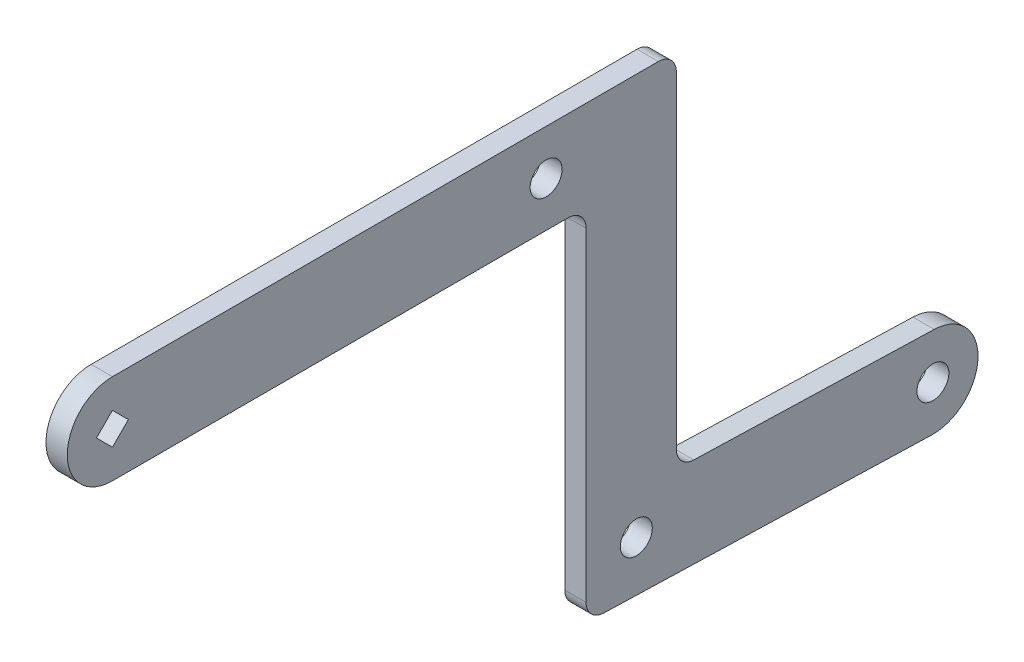
ISO-10303-21;
HEADER;
FILE_DESCRIPTION(('STEP AP214'),'2;1');
FILE_NAME('part.step','',(''),(''),'','','');
FILE_SCHEMA(('AUTOMOTIVE_DESIGN { 1 0 10303 214 1 1 1 1 }'));
ENDSEC;
DATA;
#1=APPLICATION_CONTEXT('core data for automotive mechanical design processes');
#2=APPLICATION_PROTOCOL_DEFINITION('international standard','automotive_design',2000,#1);
#3=PRODUCT_CONTEXT('',#1,'mechanical');
#4=PRODUCT('Part','Part','',(#3));
#5=PRODUCT_RELATED_PRODUCT_CATEGORY('part','',(#4));
#6=PRODUCT_DEFINITION_FORMATION('','',#4);
#7=PRODUCT_DEFINITION_CONTEXT('part definition',#1,'design');
#8=PRODUCT_DEFINITION('design','',#6,#7);
#9=PRODUCT_DEFINITION_SHAPE('','',#8);
#10=(LENGTH_UNIT() NAMED_UNIT(*) SI_UNIT(.MILLI.,.METRE.));
#11=(NAMED_UNIT(*) PLANE_ANGLE_UNIT() SI_UNIT($,.RADIAN.));
#12=(NAMED_UNIT(*) SI_UNIT($,.STERADIAN.) SOLID_ANGLE_UNIT());
#13=UNCERTAINTY_MEASURE_WITH_UNIT(LENGTH_MEASURE(1.E-05),#10,'distance_accuracy_value','');
#14=(GEOMETRIC_REPRESENTATION_CONTEXT(3) GLOBAL_UNCERTAINTY_ASSIGNED_CONTEXT((#13)) GLOBAL_UNIT_ASSIGNED_CONTEXT((#10,
#11,#12)) REPRESENTATION_CONTEXT('',''));
#15=CARTESIAN_POINT('',(0.,0.,0.));
#16=DIRECTION('',(0.,0.,1.));
#17=DIRECTION('',(1.,0.,0.));
#18=AXIS2_PLACEMENT_3D('',#15,#16,#17);
#19=CARTESIAN_POINT('',(3.,0.,0.));
#20=DIRECTION('',(1.,0.,0.));
#21=DIRECTION('',(0.,0.,-1.));
#22=AXIS2_PLACEMENT_3D('',#19,#20,#21);
#23=PLANE('',#22);
#24=CARTESIAN_POINT('',(3.,0.,-61.0422991513148));
#25=DIRECTION('',(1.,0.,0.));
#26=DIRECTION('',(0.,0.,-1.));
#27=AXIS2_PLACEMENT_3D('',#24,#25,#26);
#28=CIRCLE('',#27,2.2479);
#29=CARTESIAN_POINT('',(3.,0.,-63.2901991513148));
#30=VERTEX_POINT('',#29);
#31=EDGE_CURVE('E507',#30,#30,#28,.T.);
#32=ORIENTED_EDGE('',*,*,#31,.F.);
#33=EDGE_LOOP('',(#32));
#34=FACE_BOUND('',#33,.T.);
#35=CARTESIAN_POINT('',(3.,-50.1038340194328,-73.7422991513148));
#36=DIRECTION('',(1.,0.,0.));
#37=DIRECTION('',(0.,0.,-1.));
#38=AXIS2_PLACEMENT_3D('',#35,#36,#37);
#39=CIRCLE('',#38,2.24789999999996);
#40=CARTESIAN_POINT('',(3.,-50.1038340194328,-75.9901991513148));
#41=VERTEX_POINT('',#40);
#42=EDGE_CURVE('E509',#41,#41,#39,.T.);
#43=ORIENTED_EDGE('',*,*,#42,.F.);
#44=EDGE_LOOP('',(#43));
#45=FACE_BOUND('',#44,.T.);
#46=DIRECTION('',(0.,0.707106781186548,0.707106781186547));
#47=VECTOR('',#46,1.);
#48=CARTESIAN_POINT('',(3.,2.24506403026718,0.));
#49=LINE('',#48,#47);
#50=CARTESIAN_POINT('',(3.,0.,-2.24506403026718));
#51=VERTEX_POINT('',#50);
#52=CARTESIAN_POINT('',(3.,2.24506403026718,0.));
#53=VERTEX_POINT('',#52);
#54=EDGE_CURVE('E157',#51,#53,#49,.T.);
#55=ORIENTED_EDGE('',*,*,#54,.F.);
#56=DIRECTION('',(0.,0.707106781186548,-0.707106781186548));
#57=VECTOR('',#56,1.);
#58=CARTESIAN_POINT('',(3.,0.,-2.24506403026718));
#59=LINE('',#58,#57);
#60=CARTESIAN_POINT('',(3.,-2.24506403026719,0.));
#61=VERTEX_POINT('',#60);
#62=EDGE_CURVE('E147',#61,#51,#59,.T.);
#63=ORIENTED_EDGE('',*,*,#62,.F.);
#64=DIRECTION('',(0.,-0.707106781186548,-0.707106781186548));
#65=VECTOR('',#64,1.);
#66=CARTESIAN_POINT('',(3.,0.,2.24506403026718));
#67=LINE('',#66,#65);
#68=CARTESIAN_POINT('',(3.,0.,2.24506403026718));
#69=VERTEX_POINT('',#68);
#70=EDGE_CURVE('E172',#69,#61,#67,.T.);
#71=ORIENTED_EDGE('',*,*,#70,.F.);
#72=DIRECTION('',(0.,-0.707106781186547,0.707106781186548));
#73=VECTOR('',#72,1.);
#74=CARTESIAN_POINT('',(3.,2.24506403026718,0.));
#75=LINE('',#74,#73);
#76=EDGE_CURVE('E170',#53,#69,#75,.T.);
#77=ORIENTED_EDGE('',*,*,#76,.F.);
#78=EDGE_LOOP('',(#55,#63,#71,#77));
#79=FACE_BOUND('',#78,.T.);
#80=DIRECTION('',(0.,1.,0.));
#81=VECTOR('',#80,1.);
#82=CARTESIAN_POINT('',(3.,6.35,-79.375));
#83=LINE('',#82,#81);
#84=CARTESIAN_POINT('',(3.,-42.1719184584307,-79.375));
#85=VERTEX_POINT('',#84);
#86=CARTESIAN_POINT('',(3.,3.81,-79.375));
#87=VERTEX_POINT('',#86);
#88=EDGE_CURVE('E206',#85,#87,#83,.T.);
#89=ORIENTED_EDGE('',*,*,#88,.T.);
#90=CARTESIAN_POINT('',(3.,3.81,-76.835));
#91=DIRECTION('',(1.,0.,0.));
#92=DIRECTION('',(0.,0.,-1.));
#93=AXIS2_PLACEMENT_3D('',#90,#91,#92);
#94=CIRCLE('',#93,2.54);
#95=CARTESIAN_POINT('',(3.,6.35,-76.835));
#96=VERTEX_POINT('',#95);
#97=EDGE_CURVE('E256',#87,#96,#94,.T.);
#98=ORIENTED_EDGE('',*,*,#97,.T.);
#99=DIRECTION('',(0.,0.,1.));
#100=VECTOR('',#99,1.);
#101=CARTESIAN_POINT('',(3.,6.35,-79.375));
#102=LINE('',#101,#100);
#103=CARTESIAN_POINT('',(3.,6.35,0.));
#104=VERTEX_POINT('',#103);
#105=EDGE_CURVE('E209',#96,#104,#102,.T.);
#106=ORIENTED_EDGE('',*,*,#105,.T.);
#107=CARTESIAN_POINT('',(3.,0.,0.));
#108=DIRECTION('',(1.,0.,0.));
#109=DIRECTION('',(0.,0.,-1.));
#110=AXIS2_PLACEMENT_3D('',#107,#108,#109);
#111=CIRCLE('',#110,6.35);
#112=CARTESIAN_POINT('',(3.,-6.35,0.));
#113=VERTEX_POINT('',#112);
#114=EDGE_CURVE('E190',#104,#113,#111,.T.);
#115=ORIENTED_EDGE('',*,*,#114,.T.);
#116=DIRECTION('',(0.,0.,-1.));
#117=VECTOR('',#116,1.);
#118=CARTESIAN_POINT('',(3.,-6.35,0.));
#119=LINE('',#118,#117);
#120=CARTESIAN_POINT('',(3.,-6.35,-64.135));
#121=VERTEX_POINT('',#120);
#122=EDGE_CURVE('E193',#113,#121,#119,.T.);
#123=ORIENTED_EDGE('',*,*,#122,.T.);
#124=CARTESIAN_POINT('',(3.,-8.89,-64.135));
#125=DIRECTION('',(1.,0.,0.));
#126=DIRECTION('',(0.,0.,-1.));
#127=AXIS2_PLACEMENT_3D('',#124,#125,#126);
#128=CIRCLE('',#127,2.54);
#129=CARTESIAN_POINT('',(3.,-8.89,-66.675));
#130=VERTEX_POINT('',#129);
#131=EDGE_CURVE('E11',#121,#130,#128,.F.);
#132=ORIENTED_EDGE('',*,*,#131,.T.);
#133=DIRECTION('',(0.,-1.,0.));
#134=VECTOR('',#133,1.);
#135=CARTESIAN_POINT('',(3.,-6.35,-66.675));
#136=LINE('',#135,#134);
#137=CARTESIAN_POINT('',(3.,-54.4977492321011,-66.675));
#138=VERTEX_POINT('',#137);
#139=EDGE_CURVE('E197',#130,#138,#136,.T.);
#140=ORIENTED_EDGE('',*,*,#139,.T.);
#141=CARTESIAN_POINT('',(3.,-54.4977492321011,-69.215));
#142=DIRECTION('',(1.,0.,0.));
#143=DIRECTION('',(0.,0.,-1.));
#144=AXIS2_PLACEMENT_3D('',#141,#142,#143);
#145=CIRCLE('',#144,2.54);
#146=CARTESIAN_POINT('',(3.,-57.0366138925563,-69.1390642647262));
#147=VERTEX_POINT('',#146);
#148=EDGE_CURVE('E47',#138,#147,#145,.T.);
#149=ORIENTED_EDGE('',*,*,#148,.T.);
#150=DIRECTION('',(0.,-0.0298959587691965,-0.999553015927255));
#151=VECTOR('',#150,1.);
#152=CARTESIAN_POINT('',(3.,-56.9629153868352,-66.675));
#153=LINE('',#152,#151);
#154=CARTESIAN_POINT('',(3.,-58.4171616511381,-115.296830482406));
#155=VERTEX_POINT('',#154);
#156=EDGE_CURVE('E199',#147,#155,#153,.T.);
#157=ORIENTED_EDGE('',*,*,#156,.T.);
#158=CARTESIAN_POINT('',(3.,-52.07,-115.48666982059));
#159=DIRECTION('',(1.,0.,0.));
#160=DIRECTION('',(0.,0.,1.));
#161=AXIS2_PLACEMENT_3D('',#158,#159,#160);
#162=CIRCLE('',#161,6.35);
#163=CARTESIAN_POINT('',(3.,-45.7228383488619,-115.676509158775));
#164=VERTEX_POINT('',#163);
#165=EDGE_CURVE('E201',#155,#164,#162,.T.);
#166=ORIENTED_EDGE('',*,*,#165,.T.);
#167=DIRECTION('',(0.,0.0298959587691966,0.999553015927255));
#168=VECTOR('',#167,1.);
#169=CARTESIAN_POINT('',(3.,-45.7228383488619,-115.676509158775));
#170=LINE('',#169,#168);
#171=CARTESIAN_POINT('',(3.,-44.710783118886,-81.8390642647262));
#172=VERTEX_POINT('',#171);
#173=EDGE_CURVE('E203',#164,#172,#170,.T.);
#174=ORIENTED_EDGE('',*,*,#173,.T.);
#175=CARTESIAN_POINT('',(3.,-42.1719184584307,-81.915));
#176=DIRECTION('',(1.,0.,0.));
#177=DIRECTION('',(0.,0.,-1.));
#178=AXIS2_PLACEMENT_3D('',#175,#176,#177);
#179=CIRCLE('',#178,2.54);
#180=EDGE_CURVE('E269',#172,#85,#179,.F.);
#181=ORIENTED_EDGE('',*,*,#180,.T.);
#182=EDGE_LOOP('',(#89,#98,#106,#115,#123,#132,#140,#149,#157,#166,#174,#181));
#183=FACE_BOUND('',#182,.T.);
#184=CARTESIAN_POINT('',(3.,-52.07,-115.48666982059));
#185=DIRECTION('',(1.,0.,0.));
#186=DIRECTION('',(0.,0.,-1.));
#187=AXIS2_PLACEMENT_3D('',#184,#185,#186);
#188=CIRCLE('',#187,2.24506403026721);
#189=CARTESIAN_POINT('',(3.,-52.07,-117.731733850857));
#190=VERTEX_POINT('',#189);
#191=EDGE_CURVE('E179',#190,#190,#188,.T.);
#192=ORIENTED_EDGE('',*,*,#191,.F.);
#193=EDGE_LOOP('',(#192));
#194=FACE_BOUND('',#193,.T.);
#195=ADVANCED_FACE('F32',(#34,#45,#79,#183,#194),#23,.T.);
#196=CARTESIAN_POINT('',(0.,0.,0.));
#197=DIRECTION('',(1.,0.,0.));
#198=DIRECTION('',(0.,0.,-1.));
#199=AXIS2_PLACEMENT_3D('',#196,#197,#198);
#200=PLANE('',#199);
#201=CARTESIAN_POINT('',(0.,0.,-61.0422991513148));
#202=DIRECTION('',(1.,0.,0.));
#203=DIRECTION('',(0.,0.,-1.));
#204=AXIS2_PLACEMENT_3D('',#201,#202,#203);
#205=CIRCLE('',#204,2.2479);
#206=CARTESIAN_POINT('',(0.,0.,-63.2901991513148));
#207=VERTEX_POINT('',#206);
#208=EDGE_CURVE('E505',#207,#207,#205,.T.);
#209=ORIENTED_EDGE('',*,*,#208,.T.);
#210=EDGE_LOOP('',(#209));
#211=FACE_BOUND('',#210,.T.);
#212=CARTESIAN_POINT('',(0.,-50.1038340194328,-73.7422991513148));
#213=DIRECTION('',(1.,0.,0.));
#214=DIRECTION('',(0.,0.,-1.));
#215=AXIS2_PLACEMENT_3D('',#212,#213,#214);
#216=CIRCLE('',#215,2.24789999999996);
#217=CARTESIAN_POINT('',(0.,-50.1038340194328,-75.9901991513148));
#218=VERTEX_POINT('',#217);
#219=EDGE_CURVE('E512',#218,#218,#216,.T.);
#220=ORIENTED_EDGE('',*,*,#219,.T.);
#221=EDGE_LOOP('',(#220));
#222=FACE_BOUND('',#221,.T.);
#223=DIRECTION('',(0.,0.707106781186548,-0.707106781186548));
#224=VECTOR('',#223,1.);
#225=CARTESIAN_POINT('',(0.,0.,-2.24506403026718));
#226=LINE('',#225,#224);
#227=CARTESIAN_POINT('',(0.,-2.24506403026719,0.));
#228=VERTEX_POINT('',#227);
#229=CARTESIAN_POINT('',(0.,0.,-2.24506403026718));
#230=VERTEX_POINT('',#229);
#231=EDGE_CURVE('E177',#228,#230,#226,.T.);
#232=ORIENTED_EDGE('',*,*,#231,.T.);
#233=DIRECTION('',(0.,0.707106781186548,0.707106781186547));
#234=VECTOR('',#233,1.);
#235=CARTESIAN_POINT('',(0.,2.24506403026718,0.));
#236=LINE('',#235,#234);
#237=CARTESIAN_POINT('',(0.,2.24506403026718,0.));
#238=VERTEX_POINT('',#237);
#239=EDGE_CURVE('E164',#230,#238,#236,.T.);
#240=ORIENTED_EDGE('',*,*,#239,.T.);
#241=DIRECTION('',(0.,-0.707106781186547,0.707106781186548));
#242=VECTOR('',#241,1.);
#243=CARTESIAN_POINT('',(0.,2.24506403026718,0.));
#244=LINE('',#243,#242);
#245=CARTESIAN_POINT('',(0.,0.,2.24506403026718));
#246=VERTEX_POINT('',#245);
#247=EDGE_CURVE('E181',#238,#246,#244,.T.);
#248=ORIENTED_EDGE('',*,*,#247,.T.);
#249=DIRECTION('',(0.,-0.707106781186548,-0.707106781186548));
#250=VECTOR('',#249,1.);
#251=CARTESIAN_POINT('',(0.,0.,2.24506403026718));
#252=LINE('',#251,#250);
#253=EDGE_CURVE('E158',#246,#228,#252,.T.);
#254=ORIENTED_EDGE('',*,*,#253,.T.);
#255=EDGE_LOOP('',(#232,#240,#248,#254));
#256=FACE_BOUND('',#255,.T.);
#257=DIRECTION('',(0.,0.,1.));
#258=VECTOR('',#257,1.);
#259=CARTESIAN_POINT('',(0.,6.35,-79.375));
#260=LINE('',#259,#258);
#261=CARTESIAN_POINT('',(0.,6.35,-76.835));
#262=VERTEX_POINT('',#261);
#263=CARTESIAN_POINT('',(0.,6.35,0.));
#264=VERTEX_POINT('',#263);
#265=EDGE_CURVE('E194',#262,#264,#260,.T.);
#266=ORIENTED_EDGE('',*,*,#265,.F.);
#267=CARTESIAN_POINT('',(0.,3.81,-76.835));
#268=DIRECTION('',(1.,0.,0.));
#269=DIRECTION('',(0.,0.,-1.));
#270=AXIS2_PLACEMENT_3D('',#267,#268,#269);
#271=CIRCLE('',#270,2.54);
#272=CARTESIAN_POINT('',(0.,3.81,-79.375));
#273=VERTEX_POINT('',#272);
#274=EDGE_CURVE('E253',#262,#273,#271,.F.);
#275=ORIENTED_EDGE('',*,*,#274,.T.);
#276=DIRECTION('',(0.,1.,0.));
#277=VECTOR('',#276,1.);
#278=CARTESIAN_POINT('',(0.,6.35,-79.375));
#279=LINE('',#278,#277);
#280=CARTESIAN_POINT('',(0.,-42.1719184584307,-79.375));
#281=VERTEX_POINT('',#280);
#282=EDGE_CURVE('E226',#281,#273,#279,.T.);
#283=ORIENTED_EDGE('',*,*,#282,.F.);
#284=CARTESIAN_POINT('',(0.,-42.1719184584307,-81.915));
#285=DIRECTION('',(1.,0.,0.));
#286=DIRECTION('',(0.,0.,-1.));
#287=AXIS2_PLACEMENT_3D('',#284,#285,#286);
#288=CIRCLE('',#287,2.54);
#289=CARTESIAN_POINT('',(0.,-44.710783118886,-81.8390642647262));
#290=VERTEX_POINT('',#289);
#291=EDGE_CURVE('E267',#281,#290,#288,.T.);
#292=ORIENTED_EDGE('',*,*,#291,.T.);
#293=DIRECTION('',(0.,0.0298959587691966,0.999553015927255));
#294=VECTOR('',#293,1.);
#295=CARTESIAN_POINT('',(0.,-45.7228383488619,-115.676509158775));
#296=LINE('',#295,#294);
#297=CARTESIAN_POINT('',(0.,-45.7228383488619,-115.676509158775));
#298=VERTEX_POINT('',#297);
#299=EDGE_CURVE('E223',#298,#290,#296,.T.);
#300=ORIENTED_EDGE('',*,*,#299,.F.);
#301=CARTESIAN_POINT('',(0.,-52.07,-115.48666982059));
#302=DIRECTION('',(1.,0.,0.));
#303=DIRECTION('',(0.,0.,1.));
#304=AXIS2_PLACEMENT_3D('',#301,#302,#303);
#305=CIRCLE('',#304,6.35);
#306=CARTESIAN_POINT('',(0.,-58.4171616511381,-115.296830482406));
#307=VERTEX_POINT('',#306);
#308=EDGE_CURVE('E221',#307,#298,#305,.T.);
#309=ORIENTED_EDGE('',*,*,#308,.F.);
#310=DIRECTION('',(0.,-0.0298959587691965,-0.999553015927255));
#311=VECTOR('',#310,1.);
#312=CARTESIAN_POINT('',(0.,-56.9629153868352,-66.675));
#313=LINE('',#312,#311);
#314=CARTESIAN_POINT('',(0.,-57.0366138925563,-69.1390642647262));
#315=VERTEX_POINT('',#314);
#316=EDGE_CURVE('E219',#315,#307,#313,.T.);
#317=ORIENTED_EDGE('',*,*,#316,.F.);
#318=CARTESIAN_POINT('',(0.,-54.4977492321011,-69.215));
#319=DIRECTION('',(1.,0.,0.));
#320=DIRECTION('',(0.,0.,-1.));
#321=AXIS2_PLACEMENT_3D('',#318,#319,#320);
#322=CIRCLE('',#321,2.54);
#323=CARTESIAN_POINT('',(0.,-54.4977492321011,-66.675));
#324=VERTEX_POINT('',#323);
#325=EDGE_CURVE('E251',#315,#324,#322,.F.);
#326=ORIENTED_EDGE('',*,*,#325,.T.);
#327=DIRECTION('',(0.,-1.,0.));
#328=VECTOR('',#327,1.);
#329=CARTESIAN_POINT('',(0.,-6.35,-66.675));
#330=LINE('',#329,#328);
#331=CARTESIAN_POINT('',(0.,-8.89,-66.675));
#332=VERTEX_POINT('',#331);
#333=EDGE_CURVE('E217',#332,#324,#330,.T.);
#334=ORIENTED_EDGE('',*,*,#333,.F.);
#335=CARTESIAN_POINT('',(0.,-8.89,-64.135));
#336=DIRECTION('',(1.,0.,0.));
#337=DIRECTION('',(0.,0.,-1.));
#338=AXIS2_PLACEMENT_3D('',#335,#336,#337);
#339=CIRCLE('',#338,2.54);
#340=CARTESIAN_POINT('',(0.,-6.35,-64.135));
#341=VERTEX_POINT('',#340);
#342=EDGE_CURVE('E40',#332,#341,#339,.T.);
#343=ORIENTED_EDGE('',*,*,#342,.T.);
#344=DIRECTION('',(0.,0.,-1.));
#345=VECTOR('',#344,1.);
#346=CARTESIAN_POINT('',(0.,-6.35,0.));
#347=LINE('',#346,#345);
#348=CARTESIAN_POINT('',(0.,-6.35,0.));
#349=VERTEX_POINT('',#348);
#350=EDGE_CURVE('E214',#349,#341,#347,.T.);
#351=ORIENTED_EDGE('',*,*,#350,.F.);
#352=CARTESIAN_POINT('',(0.,0.,0.));
#353=DIRECTION('',(1.,0.,0.));
#354=DIRECTION('',(0.,0.,-1.));
#355=AXIS2_PLACEMENT_3D('',#352,#353,#354);
#356=CIRCLE('',#355,6.35);
#357=EDGE_CURVE('E165',#264,#349,#356,.T.);
#358=ORIENTED_EDGE('',*,*,#357,.F.);
#359=EDGE_LOOP('',(#266,#275,#283,#292,#300,#309,#317,#326,#334,#343,#351,#358));
#360=FACE_BOUND('',#359,.T.);
#361=CARTESIAN_POINT('',(0.,-52.07,-115.48666982059));
#362=DIRECTION('',(1.,0.,0.));
#363=DIRECTION('',(0.,0.,-1.));
#364=AXIS2_PLACEMENT_3D('',#361,#362,#363);
#365=CIRCLE('',#364,2.24506403026721);
#366=CARTESIAN_POINT('',(0.,-52.07,-117.731733850857));
#367=VERTEX_POINT('',#366);
#368=EDGE_CURVE('E515',#367,#367,#365,.T.);
#369=ORIENTED_EDGE('',*,*,#368,.T.);
#370=EDGE_LOOP('',(#369));
#371=FACE_BOUND('',#370,.T.);
#372=ADVANCED_FACE('F273',(#211,#222,#256,#360,#371),#200,.F.);
#373=CARTESIAN_POINT('',(3.,0.,0.));
#374=DIRECTION('',(-1.,0.,0.));
#375=DIRECTION('',(0.,0.,1.));
#376=AXIS2_PLACEMENT_3D('',#373,#374,#375);
#377=CYLINDRICAL_SURFACE('',#376,6.35);
#378=ORIENTED_EDGE('',*,*,#357,.T.);
#379=DIRECTION('',(-1.,0.,0.));
#380=VECTOR('',#379,1.);
#381=CARTESIAN_POINT('',(3.,-6.35,0.));
#382=LINE('',#381,#380);
#383=EDGE_CURVE('E238',#113,#349,#382,.T.);
#384=ORIENTED_EDGE('',*,*,#383,.F.);
#385=ORIENTED_EDGE('',*,*,#114,.F.);
#386=DIRECTION('',(-1.,0.,0.));
#387=VECTOR('',#386,1.);
#388=CARTESIAN_POINT('',(3.,6.35,0.));
#389=LINE('',#388,#387);
#390=EDGE_CURVE('E211',#104,#264,#389,.T.);
#391=ORIENTED_EDGE('',*,*,#390,.T.);
#392=EDGE_LOOP('',(#378,#384,#385,#391));
#393=FACE_BOUND('',#392,.T.);
#394=ADVANCED_FACE('F321',(#393),#377,.T.);
#395=CARTESIAN_POINT('',(3.,-6.35,0.));
#396=DIRECTION('',(0.,1.,0.));
#397=DIRECTION('',(0.,0.,1.));
#398=AXIS2_PLACEMENT_3D('',#395,#396,#397);
#399=PLANE('',#398);
#400=ORIENTED_EDGE('',*,*,#350,.T.);
#401=DIRECTION('',(-1.,0.,0.));
#402=VECTOR('',#401,1.);
#403=CARTESIAN_POINT('',(3.,-6.35,-64.135));
#404=LINE('',#403,#402);
#405=EDGE_CURVE('E265',#341,#121,#404,.F.);
#406=ORIENTED_EDGE('',*,*,#405,.T.);
#407=ORIENTED_EDGE('',*,*,#122,.F.);
#408=ORIENTED_EDGE('',*,*,#383,.T.);
#409=EDGE_LOOP('',(#400,#406,#407,#408));
#410=FACE_BOUND('',#409,.T.);
#411=ADVANCED_FACE('F280',(#410),#399,.F.);
#412=CARTESIAN_POINT('',(3.,-6.35,-66.675));
#413=DIRECTION('',(0.,0.,-1.));
#414=DIRECTION('',(-1.,0.,0.));
#415=AXIS2_PLACEMENT_3D('',#412,#413,#414);
#416=PLANE('',#415);
#417=ORIENTED_EDGE('',*,*,#333,.T.);
#418=DIRECTION('',(-1.,0.,0.));
#419=VECTOR('',#418,1.);
#420=CARTESIAN_POINT('',(3.,-54.4977492321011,-66.675));
#421=LINE('',#420,#419);
#422=EDGE_CURVE('E55',#324,#138,#421,.F.);
#423=ORIENTED_EDGE('',*,*,#422,.T.);
#424=ORIENTED_EDGE('',*,*,#139,.F.);
#425=DIRECTION('',(-1.,0.,0.));
#426=VECTOR('',#425,1.);
#427=CARTESIAN_POINT('',(0.,-8.89,-66.675));
#428=LINE('',#427,#426);
#429=EDGE_CURVE('E261',#130,#332,#428,.T.);
#430=ORIENTED_EDGE('',*,*,#429,.T.);
#431=EDGE_LOOP('',(#417,#423,#424,#430));
#432=FACE_BOUND('',#431,.T.);
#433=ADVANCED_FACE('F284',(#432),#416,.F.);
#434=CARTESIAN_POINT('',(3.,-56.9629153868352,-66.675));
#435=DIRECTION('',(0.,0.999553015927255,-0.0298959587691965));
#436=DIRECTION('',(0.,0.0298959587691965,0.999553015927255));
#437=AXIS2_PLACEMENT_3D('',#434,#435,#436);
#438=PLANE('',#437);
#439=ORIENTED_EDGE('',*,*,#156,.F.);
#440=DIRECTION('',(-1.,0.,0.));
#441=VECTOR('',#440,1.);
#442=CARTESIAN_POINT('',(3.,-57.0366138925563,-69.1390642647262));
#443=LINE('',#442,#441);
#444=EDGE_CURVE('E258',#147,#315,#443,.T.);
#445=ORIENTED_EDGE('',*,*,#444,.T.);
#446=ORIENTED_EDGE('',*,*,#316,.T.);
#447=DIRECTION('',(-1.,0.,0.));
#448=VECTOR('',#447,1.);
#449=CARTESIAN_POINT('',(3.,-58.4171616511381,-115.296830482406));
#450=LINE('',#449,#448);
#451=EDGE_CURVE('E235',#155,#307,#450,.T.);
#452=ORIENTED_EDGE('',*,*,#451,.F.);
#453=EDGE_LOOP('',(#439,#445,#446,#452));
#454=FACE_BOUND('',#453,.T.);
#455=ADVANCED_FACE('F290',(#454),#438,.F.);
#456=CARTESIAN_POINT('',(3.,-52.07,-115.48666982059));
#457=DIRECTION('',(-1.,0.,0.));
#458=DIRECTION('',(0.,0.,1.));
#459=AXIS2_PLACEMENT_3D('',#456,#457,#458);
#460=CYLINDRICAL_SURFACE('',#459,6.35);
#461=ORIENTED_EDGE('',*,*,#308,.T.);
#462=DIRECTION('',(-1.,0.,0.));
#463=VECTOR('',#462,1.);
#464=CARTESIAN_POINT('',(3.,-45.7228383488619,-115.676509158775));
#465=LINE('',#464,#463);
#466=EDGE_CURVE('E232',#164,#298,#465,.T.);
#467=ORIENTED_EDGE('',*,*,#466,.F.);
#468=ORIENTED_EDGE('',*,*,#165,.F.);
#469=ORIENTED_EDGE('',*,*,#451,.T.);
#470=EDGE_LOOP('',(#461,#467,#468,#469));
#471=FACE_BOUND('',#470,.T.);
#472=ADVANCED_FACE('F296',(#471),#460,.T.);
#473=CARTESIAN_POINT('',(3.,-45.7228383488619,-115.676509158775));
#474=DIRECTION('',(0.,-0.999553015927255,0.0298959587691966));
#475=DIRECTION('',(0.,-0.0298959587691966,-0.999553015927255));
#476=AXIS2_PLACEMENT_3D('',#473,#474,#475);
#477=PLANE('',#476);
#478=ORIENTED_EDGE('',*,*,#299,.T.);
#479=DIRECTION('',(-1.,0.,0.));
#480=VECTOR('',#479,1.);
#481=CARTESIAN_POINT('',(3.,-44.710783118886,-81.8390642647262));
#482=LINE('',#481,#480);
#483=EDGE_CURVE('E246',#290,#172,#482,.F.);
#484=ORIENTED_EDGE('',*,*,#483,.T.);
#485=ORIENTED_EDGE('',*,*,#173,.F.);
#486=ORIENTED_EDGE('',*,*,#466,.T.);
#487=EDGE_LOOP('',(#478,#484,#485,#486));
#488=FACE_BOUND('',#487,.T.);
#489=ADVANCED_FACE('F300',(#488),#477,.F.);
#490=CARTESIAN_POINT('',(3.,6.35,-79.375));
#491=DIRECTION('',(0.,0.,1.));
#492=DIRECTION('',(1.,0.,0.));
#493=AXIS2_PLACEMENT_3D('',#490,#491,#492);
#494=PLANE('',#493);
#495=ORIENTED_EDGE('',*,*,#88,.F.);
#496=DIRECTION('',(-1.,0.,0.));
#497=VECTOR('',#496,1.);
#498=CARTESIAN_POINT('',(0.,-42.1719184584307,-79.375));
#499=LINE('',#498,#497);
#500=EDGE_CURVE('E243',#85,#281,#499,.T.);
#501=ORIENTED_EDGE('',*,*,#500,.T.);
#502=ORIENTED_EDGE('',*,*,#282,.T.);
#503=DIRECTION('',(-1.,0.,0.));
#504=VECTOR('',#503,1.);
#505=CARTESIAN_POINT('',(3.,3.81,-79.375));
#506=LINE('',#505,#504);
#507=EDGE_CURVE('E241',#273,#87,#506,.F.);
#508=ORIENTED_EDGE('',*,*,#507,.T.);
#509=EDGE_LOOP('',(#495,#501,#502,#508));
#510=FACE_BOUND('',#509,.T.);
#511=ADVANCED_FACE('F309',(#510),#494,.F.);
#512=CARTESIAN_POINT('',(3.,6.35,-79.375));
#513=DIRECTION('',(0.,-1.,0.));
#514=DIRECTION('',(0.,0.,-1.));
#515=AXIS2_PLACEMENT_3D('',#512,#513,#514);
#516=PLANE('',#515);
#517=ORIENTED_EDGE('',*,*,#105,.F.);
#518=DIRECTION('',(-1.,0.,0.));
#519=VECTOR('',#518,1.);
#520=CARTESIAN_POINT('',(3.,6.35,-76.835));
#521=LINE('',#520,#519);
#522=EDGE_CURVE('E248',#96,#262,#521,.T.);
#523=ORIENTED_EDGE('',*,*,#522,.T.);
#524=ORIENTED_EDGE('',*,*,#265,.T.);
#525=ORIENTED_EDGE('',*,*,#390,.F.);
#526=EDGE_LOOP('',(#517,#523,#524,#525));
#527=FACE_BOUND('',#526,.T.);
#528=ADVANCED_FACE('F317',(#527),#516,.F.);
#529=CARTESIAN_POINT('',(3.,0.,-2.24506403026718));
#530=DIRECTION('',(0.,0.707106781186547,0.707106781186547));
#531=DIRECTION('',(0.,-0.707106781186548,0.707106781186548));
#532=AXIS2_PLACEMENT_3D('',#529,#530,#531);
#533=PLANE('',#532);
#534=ORIENTED_EDGE('',*,*,#231,.F.);
#535=DIRECTION('',(-1.,0.,0.));
#536=VECTOR('',#535,1.);
#537=CARTESIAN_POINT('',(3.,-2.24506403026719,0.));
#538=LINE('',#537,#536);
#539=EDGE_CURVE('E153',#61,#228,#538,.T.);
#540=ORIENTED_EDGE('',*,*,#539,.F.);
#541=ORIENTED_EDGE('',*,*,#62,.T.);
#542=DIRECTION('',(-1.,0.,0.));
#543=VECTOR('',#542,1.);
#544=CARTESIAN_POINT('',(3.,0.,-2.24506403026718));
#545=LINE('',#544,#543);
#546=EDGE_CURVE('E150',#51,#230,#545,.T.);
#547=ORIENTED_EDGE('',*,*,#546,.T.);
#548=EDGE_LOOP('',(#534,#540,#541,#547));
#549=FACE_BOUND('',#548,.T.);
#550=ADVANCED_FACE('F149',(#549),#533,.T.);
#551=CARTESIAN_POINT('',(3.,2.24506403026718,0.));
#552=DIRECTION('',(0.,-0.707106781186547,0.707106781186548));
#553=DIRECTION('',(0.,-0.707106781186548,-0.707106781186547));
#554=AXIS2_PLACEMENT_3D('',#551,#552,#553);
#555=PLANE('',#554);
#556=ORIENTED_EDGE('',*,*,#239,.F.);
#557=ORIENTED_EDGE('',*,*,#546,.F.);
#558=ORIENTED_EDGE('',*,*,#54,.T.);
#559=DIRECTION('',(-1.,0.,0.));
#560=VECTOR('',#559,1.);
#561=CARTESIAN_POINT('',(3.,2.24506403026718,0.));
#562=LINE('',#561,#560);
#563=EDGE_CURVE('E166',#53,#238,#562,.T.);
#564=ORIENTED_EDGE('',*,*,#563,.T.);
#565=EDGE_LOOP('',(#556,#557,#558,#564));
#566=FACE_BOUND('',#565,.T.);
#567=ADVANCED_FACE('F161',(#566),#555,.T.);
#568=CARTESIAN_POINT('',(3.,2.24506403026718,0.));
#569=DIRECTION('',(0.,-0.707106781186548,-0.707106781186547));
#570=DIRECTION('',(0.,0.707106781186547,-0.707106781186548));
#571=AXIS2_PLACEMENT_3D('',#568,#569,#570);
#572=PLANE('',#571);
#573=ORIENTED_EDGE('',*,*,#247,.F.);
#574=ORIENTED_EDGE('',*,*,#563,.F.);
#575=ORIENTED_EDGE('',*,*,#76,.T.);
#576=DIRECTION('',(-1.,0.,0.));
#577=VECTOR('',#576,1.);
#578=CARTESIAN_POINT('',(3.,0.,2.24506403026718));
#579=LINE('',#578,#577);
#580=EDGE_CURVE('E187',#69,#246,#579,.T.);
#581=ORIENTED_EDGE('',*,*,#580,.T.);
#582=EDGE_LOOP('',(#573,#574,#575,#581));
#583=FACE_BOUND('',#582,.T.);
#584=ADVANCED_FACE('F389',(#583),#572,.T.);
#585=CARTESIAN_POINT('',(3.,0.,2.24506403026718));
#586=DIRECTION('',(0.,0.707106781186547,-0.707106781186547));
#587=DIRECTION('',(0.,0.707106781186548,0.707106781186548));
#588=AXIS2_PLACEMENT_3D('',#585,#586,#587);
#589=PLANE('',#588);
#590=ORIENTED_EDGE('',*,*,#253,.F.);
#591=ORIENTED_EDGE('',*,*,#580,.F.);
#592=ORIENTED_EDGE('',*,*,#70,.T.);
#593=ORIENTED_EDGE('',*,*,#539,.T.);
#594=EDGE_LOOP('',(#590,#591,#592,#593));
#595=FACE_BOUND('',#594,.T.);
#596=ADVANCED_FACE('F395',(#595),#589,.T.);
#597=CARTESIAN_POINT('',(3.,-52.07,-115.48666982059));
#598=DIRECTION('',(-1.,0.,0.));
#599=DIRECTION('',(0.,0.,1.));
#600=AXIS2_PLACEMENT_3D('',#597,#598,#599);
#601=CYLINDRICAL_SURFACE('',#600,2.24506403026721);
#602=ORIENTED_EDGE('',*,*,#191,.T.);
#603=EDGE_LOOP('',(#602));
#604=FACE_BOUND('',#603,.T.);
#605=ORIENTED_EDGE('',*,*,#368,.F.);
#606=EDGE_LOOP('',(#605));
#607=FACE_BOUND('',#606,.T.);
#608=ADVANCED_FACE('F403',(#604,#607),#601,.F.);
#609=CARTESIAN_POINT('',(3.,-42.1719184584307,-81.915));
#610=DIRECTION('',(1.,0.,0.));
#611=DIRECTION('',(0.,0.,-1.));
#612=AXIS2_PLACEMENT_3D('',#609,#610,#611);
#613=CYLINDRICAL_SURFACE('',#612,2.54);
#614=ORIENTED_EDGE('',*,*,#180,.F.);
#615=ORIENTED_EDGE('',*,*,#483,.F.);
#616=ORIENTED_EDGE('',*,*,#291,.F.);
#617=ORIENTED_EDGE('',*,*,#500,.F.);
#618=EDGE_LOOP('',(#614,#615,#616,#617));
#619=FACE_BOUND('',#618,.T.);
#620=ADVANCED_FACE('F306',(#619),#613,.F.);
#621=CARTESIAN_POINT('',(3.,3.81,-76.835));
#622=DIRECTION('',(-1.,0.,0.));
#623=DIRECTION('',(0.,0.,1.));
#624=AXIS2_PLACEMENT_3D('',#621,#622,#623);
#625=CYLINDRICAL_SURFACE('',#624,2.54);
#626=ORIENTED_EDGE('',*,*,#97,.F.);
#627=ORIENTED_EDGE('',*,*,#507,.F.);
#628=ORIENTED_EDGE('',*,*,#274,.F.);
#629=ORIENTED_EDGE('',*,*,#522,.F.);
#630=EDGE_LOOP('',(#626,#627,#628,#629));
#631=FACE_BOUND('',#630,.T.);
#632=ADVANCED_FACE('F314',(#631),#625,.T.);
#633=CARTESIAN_POINT('',(3.,-54.4977492321011,-69.215));
#634=DIRECTION('',(-1.,0.,0.));
#635=DIRECTION('',(0.,0.,1.));
#636=AXIS2_PLACEMENT_3D('',#633,#634,#635);
#637=CYLINDRICAL_SURFACE('',#636,2.54);
#638=ORIENTED_EDGE('',*,*,#148,.F.);
#639=ORIENTED_EDGE('',*,*,#422,.F.);
#640=ORIENTED_EDGE('',*,*,#325,.F.);
#641=ORIENTED_EDGE('',*,*,#444,.F.);
#642=EDGE_LOOP('',(#638,#639,#640,#641));
#643=FACE_BOUND('',#642,.T.);
#644=ADVANCED_FACE('F286',(#643),#637,.T.);
#645=CARTESIAN_POINT('',(3.,-8.89,-64.135));
#646=DIRECTION('',(1.,0.,0.));
#647=DIRECTION('',(0.,0.,-1.));
#648=AXIS2_PLACEMENT_3D('',#645,#646,#647);
#649=CYLINDRICAL_SURFACE('',#648,2.54);
#650=ORIENTED_EDGE('',*,*,#131,.F.);
#651=ORIENTED_EDGE('',*,*,#405,.F.);
#652=ORIENTED_EDGE('',*,*,#342,.F.);
#653=ORIENTED_EDGE('',*,*,#429,.F.);
#654=EDGE_LOOP('',(#650,#651,#652,#653));
#655=FACE_BOUND('',#654,.T.);
#656=ADVANCED_FACE('F34',(#655),#649,.F.);
#657=CARTESIAN_POINT('',(0.,-50.1038340194328,-73.7422991513148));
#658=DIRECTION('',(1.,0.,0.));
#659=DIRECTION('',(0.,0.,-1.));
#660=AXIS2_PLACEMENT_3D('',#657,#658,#659);
#661=CYLINDRICAL_SURFACE('',#660,2.24789999999996);
#662=ORIENTED_EDGE('',*,*,#219,.F.);
#663=EDGE_LOOP('',(#662));
#664=FACE_BOUND('',#663,.T.);
#665=ORIENTED_EDGE('',*,*,#42,.T.);
#666=EDGE_LOOP('',(#665));
#667=FACE_BOUND('',#666,.T.);
#668=ADVANCED_FACE('F433',(#664,#667),#661,.F.);
#669=CARTESIAN_POINT('',(0.,0.,-61.0422991513148));
#670=DIRECTION('',(1.,0.,0.));
#671=DIRECTION('',(0.,0.,-1.));
#672=AXIS2_PLACEMENT_3D('',#669,#670,#671);
#673=CYLINDRICAL_SURFACE('',#672,2.2479);
#674=ORIENTED_EDGE('',*,*,#208,.F.);
#675=EDGE_LOOP('',(#674));
#676=FACE_BOUND('',#675,.T.);
#677=ORIENTED_EDGE('',*,*,#31,.T.);
#678=EDGE_LOOP('',(#677));
#679=FACE_BOUND('',#678,.T.);
#680=ADVANCED_FACE('F439',(#676,#679),#673,.F.);
#681=CLOSED_SHELL('',(#195,#372,#394,#411,#433,#455,#472,#489,#511,#528,#550,#567,#584,#596,
#608,#620,#632,#644,#656,#668,#680));
#682=MANIFOLD_SOLID_BREP('B2',#681);
#683=ADVANCED_BREP_SHAPE_REPRESENTATION('',(#18,#682),#14);
#684=SHAPE_DEFINITION_REPRESENTATION(#9,#683);
ENDSEC;
END-ISO-10303-21;
